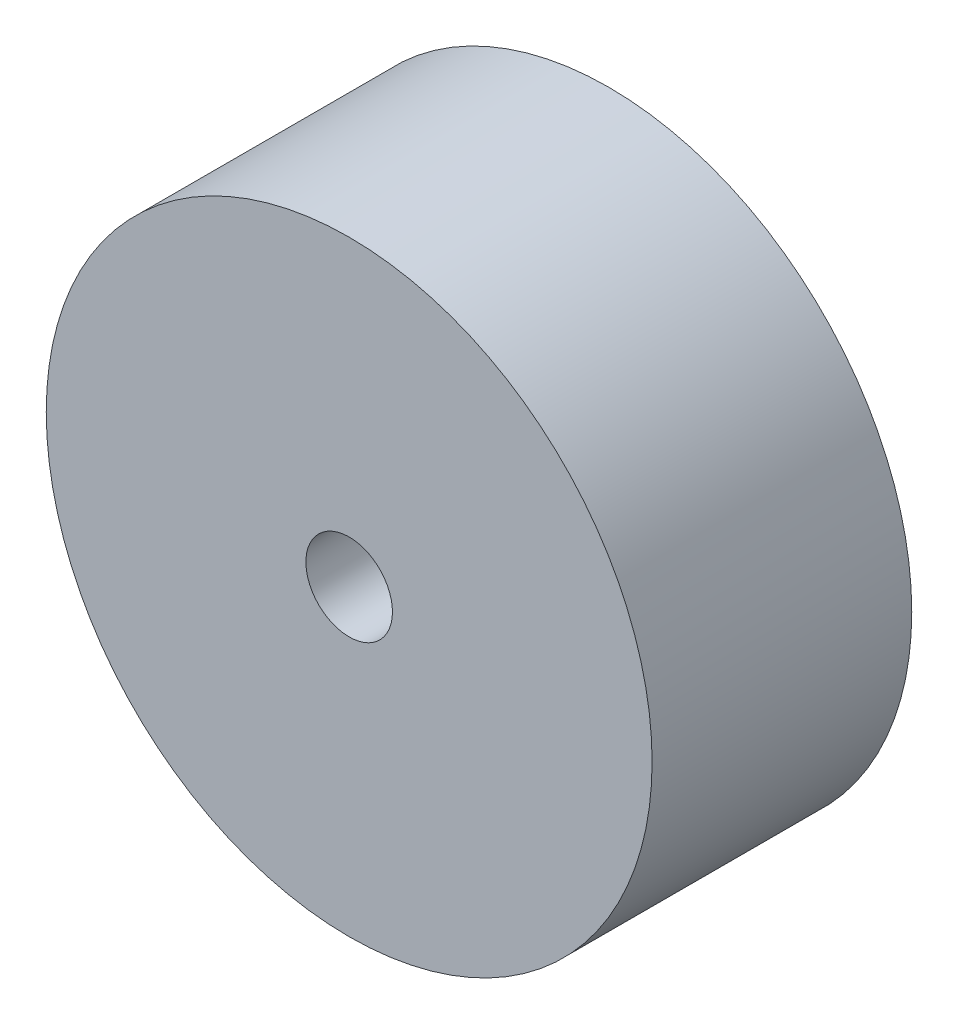
ISO-10303-21;
HEADER;
FILE_DESCRIPTION(('STEP AP214'),'2;1');
FILE_NAME('part.step','',(''),(''),'','','');
FILE_SCHEMA(('AUTOMOTIVE_DESIGN { 1 0 10303 214 1 1 1 1 }'));
ENDSEC;
DATA;
#1=APPLICATION_CONTEXT('core data for automotive mechanical design processes');
#2=APPLICATION_PROTOCOL_DEFINITION('international standard','automotive_design',2000,#1);
#3=PRODUCT_CONTEXT('',#1,'mechanical');
#4=PRODUCT('Part','Part','',(#3));
#5=PRODUCT_RELATED_PRODUCT_CATEGORY('part','',(#4));
#6=PRODUCT_DEFINITION_FORMATION('','',#4);
#7=PRODUCT_DEFINITION_CONTEXT('part definition',#1,'design');
#8=PRODUCT_DEFINITION('design','',#6,#7);
#9=PRODUCT_DEFINITION_SHAPE('','',#8);
#10=(LENGTH_UNIT() NAMED_UNIT(*) SI_UNIT(.MILLI.,.METRE.));
#11=(NAMED_UNIT(*) PLANE_ANGLE_UNIT() SI_UNIT($,.RADIAN.));
#12=(NAMED_UNIT(*) SI_UNIT($,.STERADIAN.) SOLID_ANGLE_UNIT());
#13=UNCERTAINTY_MEASURE_WITH_UNIT(LENGTH_MEASURE(1.E-05),#10,'distance_accuracy_value','');
#14=(GEOMETRIC_REPRESENTATION_CONTEXT(3) GLOBAL_UNCERTAINTY_ASSIGNED_CONTEXT((#13)) GLOBAL_UNIT_ASSIGNED_CONTEXT((#10,
#11,#12)) REPRESENTATION_CONTEXT('',''));
#15=CARTESIAN_POINT('',(0.,0.,0.));
#16=DIRECTION('',(0.,0.,1.));
#17=DIRECTION('',(1.,0.,0.));
#18=AXIS2_PLACEMENT_3D('',#15,#16,#17);
#19=CARTESIAN_POINT('',(0.,0.,-30.));
#20=DIRECTION('',(0.,0.,1.));
#21=DIRECTION('',(1.,0.,0.));
#22=AXIS2_PLACEMENT_3D('',#19,#20,#21);
#23=CYLINDRICAL_SURFACE('',#22,35.);
#24=CARTESIAN_POINT('',(0.,0.,-30.));
#25=DIRECTION('',(0.,0.,1.));
#26=DIRECTION('',(1.,0.,0.));
#27=AXIS2_PLACEMENT_3D('',#24,#25,#26);
#28=CIRCLE('',#27,35.);
#29=CARTESIAN_POINT('',(35.,0.,-30.));
#30=VERTEX_POINT('',#29);
#31=EDGE_CURVE('E10',#30,#30,#28,.T.);
#32=ORIENTED_EDGE('',*,*,#31,.T.);
#33=EDGE_LOOP('',(#32));
#34=FACE_BOUND('',#33,.T.);
#35=CARTESIAN_POINT('',(0.,0.,0.));
#36=DIRECTION('',(0.,0.,1.));
#37=DIRECTION('',(1.,0.,0.));
#38=AXIS2_PLACEMENT_3D('',#35,#36,#37);
#39=CIRCLE('',#38,35.);
#40=CARTESIAN_POINT('',(35.,0.,0.));
#41=VERTEX_POINT('',#40);
#42=EDGE_CURVE('E38',#41,#41,#39,.T.);
#43=ORIENTED_EDGE('',*,*,#42,.F.);
#44=EDGE_LOOP('',(#43));
#45=FACE_BOUND('',#44,.T.);
#46=ADVANCED_FACE('F35',(#34,#45),#23,.T.);
#47=CARTESIAN_POINT('',(0.,0.,-30.));
#48=DIRECTION('',(0.,0.,1.));
#49=DIRECTION('',(1.,0.,0.));
#50=AXIS2_PLACEMENT_3D('',#47,#48,#49);
#51=PLANE('',#50);
#52=CARTESIAN_POINT('',(0.,0.,-30.));
#53=DIRECTION('',(0.,0.,1.));
#54=DIRECTION('',(1.,0.,0.));
#55=AXIS2_PLACEMENT_3D('',#52,#53,#54);
#56=CIRCLE('',#55,5.);
#57=CARTESIAN_POINT('',(5.,0.,-30.));
#58=VERTEX_POINT('',#57);
#59=EDGE_CURVE('E45',#58,#58,#56,.T.);
#60=ORIENTED_EDGE('',*,*,#59,.T.);
#61=EDGE_LOOP('',(#60));
#62=FACE_BOUND('',#61,.T.);
#63=ORIENTED_EDGE('',*,*,#31,.F.);
#64=EDGE_LOOP('',(#63));
#65=FACE_BOUND('',#64,.T.);
#66=ADVANCED_FACE('F53',(#62,#65),#51,.F.);
#67=CARTESIAN_POINT('',(0.,0.,0.));
#68=DIRECTION('',(0.,0.,1.));
#69=DIRECTION('',(1.,0.,0.));
#70=AXIS2_PLACEMENT_3D('',#67,#68,#69);
#71=PLANE('',#70);
#72=CARTESIAN_POINT('',(0.,0.,0.));
#73=DIRECTION('',(0.,0.,1.));
#74=DIRECTION('',(1.,0.,0.));
#75=AXIS2_PLACEMENT_3D('',#72,#73,#74);
#76=CIRCLE('',#75,5.);
#77=CARTESIAN_POINT('',(5.,0.,0.));
#78=VERTEX_POINT('',#77);
#79=EDGE_CURVE('E47',#78,#78,#76,.T.);
#80=ORIENTED_EDGE('',*,*,#79,.F.);
#81=EDGE_LOOP('',(#80));
#82=FACE_BOUND('',#81,.T.);
#83=ORIENTED_EDGE('',*,*,#42,.T.);
#84=EDGE_LOOP('',(#83));
#85=FACE_BOUND('',#84,.T.);
#86=ADVANCED_FACE('F59',(#82,#85),#71,.T.);
#87=CARTESIAN_POINT('',(0.,0.,-30.));
#88=DIRECTION('',(0.,0.,1.));
#89=DIRECTION('',(1.,0.,0.));
#90=AXIS2_PLACEMENT_3D('',#87,#88,#89);
#91=CYLINDRICAL_SURFACE('',#90,5.);
#92=ORIENTED_EDGE('',*,*,#59,.F.);
#93=EDGE_LOOP('',(#92));
#94=FACE_BOUND('',#93,.T.);
#95=ORIENTED_EDGE('',*,*,#79,.T.);
#96=EDGE_LOOP('',(#95));
#97=FACE_BOUND('',#96,.T.);
#98=ADVANCED_FACE('F56',(#94,#97),#91,.F.);
#99=CLOSED_SHELL('',(#46,#66,#86,#98));
#100=MANIFOLD_SOLID_BREP('B2',#99);
#101=ADVANCED_BREP_SHAPE_REPRESENTATION('',(#18,#100),#14);
#102=SHAPE_DEFINITION_REPRESENTATION(#9,#101);
ENDSEC;
END-ISO-10303-21;
